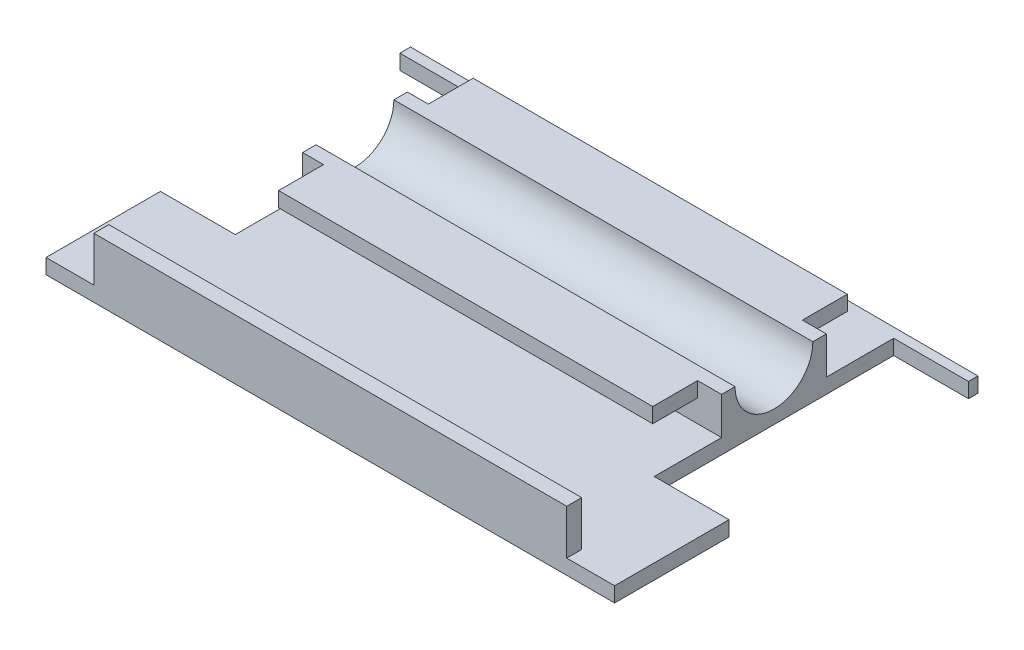
ISO-10303-21;
HEADER;
FILE_DESCRIPTION(('STEP AP214'),'2;1');
FILE_NAME('part.step','',(''),(''),'','','');
FILE_SCHEMA(('AUTOMOTIVE_DESIGN { 1 0 10303 214 1 1 1 1 }'));
ENDSEC;
DATA;
#1=APPLICATION_CONTEXT('core data for automotive mechanical design processes');
#2=APPLICATION_PROTOCOL_DEFINITION('international standard','automotive_design',2000,#1);
#3=PRODUCT_CONTEXT('',#1,'mechanical');
#4=PRODUCT('Part','Part','',(#3));
#5=PRODUCT_RELATED_PRODUCT_CATEGORY('part','',(#4));
#6=PRODUCT_DEFINITION_FORMATION('','',#4);
#7=PRODUCT_DEFINITION_CONTEXT('part definition',#1,'design');
#8=PRODUCT_DEFINITION('design','',#6,#7);
#9=PRODUCT_DEFINITION_SHAPE('','',#8);
#10=(LENGTH_UNIT() NAMED_UNIT(*) SI_UNIT(.MILLI.,.METRE.));
#11=(NAMED_UNIT(*) PLANE_ANGLE_UNIT() SI_UNIT($,.RADIAN.));
#12=(NAMED_UNIT(*) SI_UNIT($,.STERADIAN.) SOLID_ANGLE_UNIT());
#13=UNCERTAINTY_MEASURE_WITH_UNIT(LENGTH_MEASURE(1.E-05),#10,'distance_accuracy_value','');
#14=(GEOMETRIC_REPRESENTATION_CONTEXT(3) GLOBAL_UNCERTAINTY_ASSIGNED_CONTEXT((#13)) GLOBAL_UNIT_ASSIGNED_CONTEXT((#10,
#11,#12)) REPRESENTATION_CONTEXT('',''));
#15=CARTESIAN_POINT('',(0.,0.,0.));
#16=DIRECTION('',(0.,0.,1.));
#17=DIRECTION('',(1.,0.,0.));
#18=AXIS2_PLACEMENT_3D('',#15,#16,#17);
#19=CARTESIAN_POINT('',(-79.,20.,-66.7625819213889));
#20=DIRECTION('',(0.,0.,1.));
#21=DIRECTION('',(1.,0.,0.));
#22=AXIS2_PLACEMENT_3D('',#19,#20,#21);
#23=PLANE('',#22);
#24=DIRECTION('',(1.,0.,0.));
#25=VECTOR('',#24,1.);
#26=CARTESIAN_POINT('',(0.,20.,-66.7625819213889));
#27=LINE('',#26,#25);
#28=CARTESIAN_POINT('',(-79.,20.,-66.7625819213889));
#29=VERTEX_POINT('',#28);
#30=CARTESIAN_POINT('',(79.,20.,-66.7625819213889));
#31=VERTEX_POINT('',#30);
#32=EDGE_CURVE('E259',#29,#31,#27,.T.);
#33=ORIENTED_EDGE('',*,*,#32,.F.);
#34=DIRECTION('',(0.,-1.,0.));
#35=VECTOR('',#34,1.);
#36=CARTESIAN_POINT('',(-79.,20.,-66.7625819213889));
#37=LINE('',#36,#35);
#38=CARTESIAN_POINT('',(-79.,5.,-66.7625819213889));
#39=VERTEX_POINT('',#38);
#40=EDGE_CURVE('E274',#29,#39,#37,.T.);
#41=ORIENTED_EDGE('',*,*,#40,.T.);
#42=DIRECTION('',(1.,0.,0.));
#43=VECTOR('',#42,1.);
#44=CARTESIAN_POINT('',(0.,5.,-66.7625819213889));
#45=LINE('',#44,#43);
#46=CARTESIAN_POINT('',(-95.,5.,-66.7625819213889));
#47=VERTEX_POINT('',#46);
#48=EDGE_CURVE('E278',#47,#39,#45,.T.);
#49=ORIENTED_EDGE('',*,*,#48,.F.);
#50=DIRECTION('',(0.,1.,0.));
#51=VECTOR('',#50,1.);
#52=CARTESIAN_POINT('',(-95.,0.,-66.7625819213889));
#53=LINE('',#52,#51);
#54=CARTESIAN_POINT('',(-95.,0.,-66.7625819213889));
#55=VERTEX_POINT('',#54);
#56=EDGE_CURVE('E427',#55,#47,#53,.T.);
#57=ORIENTED_EDGE('',*,*,#56,.F.);
#58=DIRECTION('',(1.,0.,0.));
#59=VECTOR('',#58,1.);
#60=CARTESIAN_POINT('',(0.,0.,-66.7625819213889));
#61=LINE('',#60,#59);
#62=CARTESIAN_POINT('',(95.,0.,-66.7625819213889));
#63=VERTEX_POINT('',#62);
#64=EDGE_CURVE('E284',#55,#63,#61,.T.);
#65=ORIENTED_EDGE('',*,*,#64,.T.);
#66=DIRECTION('',(0.,-1.,0.));
#67=VECTOR('',#66,1.);
#68=CARTESIAN_POINT('',(95.,0.,-66.7625819213889));
#69=LINE('',#68,#67);
#70=CARTESIAN_POINT('',(95.,5.,-66.7625819213889));
#71=VERTEX_POINT('',#70);
#72=EDGE_CURVE('E294',#71,#63,#69,.T.);
#73=ORIENTED_EDGE('',*,*,#72,.F.);
#74=CARTESIAN_POINT('',(79.,5.,-66.7625819213889));
#75=VERTEX_POINT('',#74);
#76=EDGE_CURVE('E430',#75,#71,#45,.T.);
#77=ORIENTED_EDGE('',*,*,#76,.F.);
#78=DIRECTION('',(0.,1.,0.));
#79=VECTOR('',#78,1.);
#80=CARTESIAN_POINT('',(79.,20.,-66.7625819213889));
#81=LINE('',#80,#79);
#82=EDGE_CURVE('E276',#75,#31,#81,.T.);
#83=ORIENTED_EDGE('',*,*,#82,.T.);
#84=EDGE_LOOP('',(#33,#41,#49,#57,#65,#73,#77,#83));
#85=FACE_BOUND('',#84,.T.);
#86=ADVANCED_FACE('F47',(#85),#23,.T.);
#87=CARTESIAN_POINT('',(0.,0.,-112.5));
#88=DIRECTION('',(0.,0.,1.));
#89=DIRECTION('',(1.,0.,0.));
#90=AXIS2_PLACEMENT_3D('',#87,#88,#89);
#91=PLANE('',#90);
#92=DIRECTION('',(0.,-1.,0.));
#93=VECTOR('',#92,1.);
#94=CARTESIAN_POINT('',(-63.,17.5,-112.5));
#95=LINE('',#94,#93);
#96=CARTESIAN_POINT('',(-63.,17.5,-112.5));
#97=VERTEX_POINT('',#96);
#98=CARTESIAN_POINT('',(-63.,12.5,-112.5));
#99=VERTEX_POINT('',#98);
#100=EDGE_CURVE('E489',#97,#99,#95,.T.);
#101=ORIENTED_EDGE('',*,*,#100,.T.);
#102=DIRECTION('',(1.,0.,0.));
#103=VECTOR('',#102,1.);
#104=CARTESIAN_POINT('',(-63.,12.5,-112.5));
#105=LINE('',#104,#103);
#106=CARTESIAN_POINT('',(62.,12.5,-112.5));
#107=VERTEX_POINT('',#106);
#108=EDGE_CURVE('E493',#99,#107,#105,.T.);
#109=ORIENTED_EDGE('',*,*,#108,.T.);
#110=DIRECTION('',(0.,1.,0.));
#111=VECTOR('',#110,1.);
#112=CARTESIAN_POINT('',(62.,17.5,-112.5));
#113=LINE('',#112,#111);
#114=CARTESIAN_POINT('',(62.,17.5,-112.5));
#115=VERTEX_POINT('',#114);
#116=EDGE_CURVE('E497',#107,#115,#113,.T.);
#117=ORIENTED_EDGE('',*,*,#116,.T.);
#118=DIRECTION('',(-1.,0.,0.));
#119=VECTOR('',#118,1.);
#120=CARTESIAN_POINT('',(-63.,17.5,-112.5));
#121=LINE('',#120,#119);
#122=EDGE_CURVE('E500',#115,#97,#121,.T.);
#123=ORIENTED_EDGE('',*,*,#122,.T.);
#124=EDGE_LOOP('',(#101,#109,#117,#123));
#125=FACE_BOUND('',#124,.T.);
#126=ADVANCED_FACE('F659',(#125),#91,.T.);
#127=CARTESIAN_POINT('',(62.,12.5,-177.5));
#128=DIRECTION('',(0.,1.,0.));
#129=DIRECTION('',(0.,0.,1.));
#130=AXIS2_PLACEMENT_3D('',#127,#128,#129);
#131=PLANE('',#130);
#132=DIRECTION('',(-1.,0.,0.));
#133=VECTOR('',#132,1.);
#134=CARTESIAN_POINT('',(62.,12.5,-162.5));
#135=LINE('',#134,#133);
#136=CARTESIAN_POINT('',(62.,12.5,-162.5));
#137=VERTEX_POINT('',#136);
#138=CARTESIAN_POINT('',(-63.,12.5,-162.5));
#139=VERTEX_POINT('',#138);
#140=EDGE_CURVE('E471',#137,#139,#135,.T.);
#141=ORIENTED_EDGE('',*,*,#140,.T.);
#142=DIRECTION('',(0.,0.,1.));
#143=VECTOR('',#142,1.);
#144=CARTESIAN_POINT('',(-63.,12.5,-177.5));
#145=LINE('',#144,#143);
#146=CARTESIAN_POINT('',(-63.,12.5,-177.5));
#147=VERTEX_POINT('',#146);
#148=EDGE_CURVE('E73',#147,#139,#145,.T.);
#149=ORIENTED_EDGE('',*,*,#148,.F.);
#150=DIRECTION('',(-1.,0.,0.));
#151=VECTOR('',#150,1.);
#152=CARTESIAN_POINT('',(62.,12.5,-177.5));
#153=LINE('',#152,#151);
#154=CARTESIAN_POINT('',(62.,12.5,-177.5));
#155=VERTEX_POINT('',#154);
#156=EDGE_CURVE('E462',#155,#147,#153,.T.);
#157=ORIENTED_EDGE('',*,*,#156,.F.);
#158=DIRECTION('',(0.,0.,1.));
#159=VECTOR('',#158,1.);
#160=CARTESIAN_POINT('',(62.,12.5,-177.5));
#161=LINE('',#160,#159);
#162=EDGE_CURVE('E481',#155,#137,#161,.T.);
#163=ORIENTED_EDGE('',*,*,#162,.T.);
#164=EDGE_LOOP('',(#141,#149,#157,#163));
#165=FACE_BOUND('',#164,.T.);
#166=ADVANCED_FACE('F676',(#165),#131,.F.);
#167=CARTESIAN_POINT('',(-63.,12.5,-177.5));
#168=DIRECTION('',(1.,0.,0.));
#169=DIRECTION('',(0.,0.,-1.));
#170=AXIS2_PLACEMENT_3D('',#167,#168,#169);
#171=PLANE('',#170);
#172=DIRECTION('',(0.,1.,0.));
#173=VECTOR('',#172,1.);
#174=CARTESIAN_POINT('',(-63.,12.5,-162.5));
#175=LINE('',#174,#173);
#176=CARTESIAN_POINT('',(-63.,17.5,-162.5));
#177=VERTEX_POINT('',#176);
#178=EDGE_CURVE('E459',#139,#177,#175,.T.);
#179=ORIENTED_EDGE('',*,*,#178,.T.);
#180=DIRECTION('',(0.,0.,1.));
#181=VECTOR('',#180,1.);
#182=CARTESIAN_POINT('',(-63.,17.5,-177.5));
#183=LINE('',#182,#181);
#184=CARTESIAN_POINT('',(-63.,17.5,-177.5));
#185=VERTEX_POINT('',#184);
#186=EDGE_CURVE('E468',#185,#177,#183,.T.);
#187=ORIENTED_EDGE('',*,*,#186,.F.);
#188=DIRECTION('',(0.,1.,0.));
#189=VECTOR('',#188,1.);
#190=CARTESIAN_POINT('',(-63.,12.5,-177.5));
#191=LINE('',#190,#189);
#192=EDGE_CURVE('E465',#147,#185,#191,.T.);
#193=ORIENTED_EDGE('',*,*,#192,.F.);
#194=ORIENTED_EDGE('',*,*,#148,.T.);
#195=EDGE_LOOP('',(#179,#187,#193,#194));
#196=FACE_BOUND('',#195,.T.);
#197=ADVANCED_FACE('F682',(#196),#171,.F.);
#198=CARTESIAN_POINT('',(0.,0.,-177.5));
#199=DIRECTION('',(0.,0.,-1.));
#200=DIRECTION('',(-1.,0.,0.));
#201=AXIS2_PLACEMENT_3D('',#198,#199,#200);
#202=PLANE('',#201);
#203=DIRECTION('',(1.,0.,0.));
#204=VECTOR('',#203,1.);
#205=CARTESIAN_POINT('',(-63.,17.5,-177.5));
#206=LINE('',#205,#204);
#207=CARTESIAN_POINT('',(62.,17.5,-177.5));
#208=VERTEX_POINT('',#207);
#209=EDGE_CURVE('E454',#185,#208,#206,.T.);
#210=ORIENTED_EDGE('',*,*,#209,.T.);
#211=DIRECTION('',(0.,-1.,0.));
#212=VECTOR('',#211,1.);
#213=CARTESIAN_POINT('',(62.,17.5,-177.5));
#214=LINE('',#213,#212);
#215=EDGE_CURVE('E458',#208,#155,#214,.T.);
#216=ORIENTED_EDGE('',*,*,#215,.T.);
#217=ORIENTED_EDGE('',*,*,#156,.T.);
#218=ORIENTED_EDGE('',*,*,#192,.T.);
#219=EDGE_LOOP('',(#210,#216,#217,#218));
#220=FACE_BOUND('',#219,.T.);
#221=ADVANCED_FACE('F692',(#220),#202,.T.);
#222=CARTESIAN_POINT('',(62.,17.5,-177.5));
#223=DIRECTION('',(-1.,0.,0.));
#224=DIRECTION('',(0.,0.,1.));
#225=AXIS2_PLACEMENT_3D('',#222,#223,#224);
#226=PLANE('',#225);
#227=DIRECTION('',(0.,-1.,0.));
#228=VECTOR('',#227,1.);
#229=CARTESIAN_POINT('',(62.,17.5,-162.5));
#230=LINE('',#229,#228);
#231=CARTESIAN_POINT('',(62.,17.5,-162.5));
#232=VERTEX_POINT('',#231);
#233=EDGE_CURVE('E441',#232,#137,#230,.T.);
#234=ORIENTED_EDGE('',*,*,#233,.T.);
#235=ORIENTED_EDGE('',*,*,#162,.F.);
#236=ORIENTED_EDGE('',*,*,#215,.F.);
#237=DIRECTION('',(0.,0.,1.));
#238=VECTOR('',#237,1.);
#239=CARTESIAN_POINT('',(62.,17.5,-177.5));
#240=LINE('',#239,#238);
#241=EDGE_CURVE('E485',#208,#232,#240,.T.);
#242=ORIENTED_EDGE('',*,*,#241,.T.);
#243=EDGE_LOOP('',(#234,#235,#236,#242));
#244=FACE_BOUND('',#243,.T.);
#245=ADVANCED_FACE('F687',(#244),#226,.F.);
#246=CARTESIAN_POINT('',(62.,17.5,-112.5));
#247=DIRECTION('',(-1.,0.,0.));
#248=DIRECTION('',(0.,0.,1.));
#249=AXIS2_PLACEMENT_3D('',#246,#247,#248);
#250=PLANE('',#249);
#251=DIRECTION('',(0.,1.,0.));
#252=VECTOR('',#251,1.);
#253=CARTESIAN_POINT('',(62.,17.5,-127.5));
#254=LINE('',#253,#252);
#255=CARTESIAN_POINT('',(62.,12.5,-127.5));
#256=VERTEX_POINT('',#255);
#257=CARTESIAN_POINT('',(62.,17.5,-127.5));
#258=VERTEX_POINT('',#257);
#259=EDGE_CURVE('E494',#256,#258,#254,.T.);
#260=ORIENTED_EDGE('',*,*,#259,.T.);
#261=DIRECTION('',(0.,0.,-1.));
#262=VECTOR('',#261,1.);
#263=CARTESIAN_POINT('',(62.,17.5,-112.5));
#264=LINE('',#263,#262);
#265=EDGE_CURVE('E515',#115,#258,#264,.T.);
#266=ORIENTED_EDGE('',*,*,#265,.F.);
#267=ORIENTED_EDGE('',*,*,#116,.F.);
#268=DIRECTION('',(0.,0.,-1.));
#269=VECTOR('',#268,1.);
#270=CARTESIAN_POINT('',(62.,12.5,-112.5));
#271=LINE('',#270,#269);
#272=EDGE_CURVE('E518',#107,#256,#271,.T.);
#273=ORIENTED_EDGE('',*,*,#272,.T.);
#274=EDGE_LOOP('',(#260,#266,#267,#273));
#275=FACE_BOUND('',#274,.T.);
#276=ADVANCED_FACE('F663',(#275),#250,.F.);
#277=CARTESIAN_POINT('',(-63.,17.5,-112.5));
#278=DIRECTION('',(1.,0.,0.));
#279=DIRECTION('',(0.,0.,-1.));
#280=AXIS2_PLACEMENT_3D('',#277,#278,#279);
#281=PLANE('',#280);
#282=DIRECTION('',(0.,-1.,0.));
#283=VECTOR('',#282,1.);
#284=CARTESIAN_POINT('',(-63.,17.5,-127.5));
#285=LINE('',#284,#283);
#286=CARTESIAN_POINT('',(-63.,17.5,-127.5));
#287=VERTEX_POINT('',#286);
#288=CARTESIAN_POINT('',(-63.,12.5,-127.5));
#289=VERTEX_POINT('',#288);
#290=EDGE_CURVE('E488',#287,#289,#285,.T.);
#291=ORIENTED_EDGE('',*,*,#290,.T.);
#292=DIRECTION('',(0.,0.,-1.));
#293=VECTOR('',#292,1.);
#294=CARTESIAN_POINT('',(-63.,12.5,-112.5));
#295=LINE('',#294,#293);
#296=EDGE_CURVE('E522',#99,#289,#295,.T.);
#297=ORIENTED_EDGE('',*,*,#296,.F.);
#298=ORIENTED_EDGE('',*,*,#100,.F.);
#299=DIRECTION('',(0.,0.,-1.));
#300=VECTOR('',#299,1.);
#301=CARTESIAN_POINT('',(-63.,17.5,-112.5));
#302=LINE('',#301,#300);
#303=EDGE_CURVE('E503',#97,#287,#302,.T.);
#304=ORIENTED_EDGE('',*,*,#303,.T.);
#305=EDGE_LOOP('',(#291,#297,#298,#304));
#306=FACE_BOUND('',#305,.T.);
#307=ADVANCED_FACE('F657',(#306),#281,.F.);
#308=CARTESIAN_POINT('',(-63.,12.5,-112.5));
#309=DIRECTION('',(0.,1.,0.));
#310=DIRECTION('',(0.,0.,1.));
#311=AXIS2_PLACEMENT_3D('',#308,#309,#310);
#312=PLANE('',#311);
#313=DIRECTION('',(1.,0.,0.));
#314=VECTOR('',#313,1.);
#315=CARTESIAN_POINT('',(-63.,12.5,-127.5));
#316=LINE('',#315,#314);
#317=EDGE_CURVE('E507',#289,#256,#316,.T.);
#318=ORIENTED_EDGE('',*,*,#317,.T.);
#319=ORIENTED_EDGE('',*,*,#272,.F.);
#320=ORIENTED_EDGE('',*,*,#108,.F.);
#321=ORIENTED_EDGE('',*,*,#296,.T.);
#322=EDGE_LOOP('',(#318,#319,#320,#321));
#323=FACE_BOUND('',#322,.T.);
#324=ADVANCED_FACE('F665',(#323),#312,.F.);
#325=CARTESIAN_POINT('',(-70.,17.5,-127.5));
#326=DIRECTION('',(0.,1.,0.));
#327=DIRECTION('',(0.,0.,1.));
#328=AXIS2_PLACEMENT_3D('',#325,#326,#327);
#329=PLANE('',#328);
#330=DIRECTION('',(0.,0.,1.));
#331=VECTOR('',#330,1.);
#332=CARTESIAN_POINT('',(70.,17.5,-127.5));
#333=LINE('',#332,#331);
#334=CARTESIAN_POINT('',(70.,17.5,-132.));
#335=VERTEX_POINT('',#334);
#336=CARTESIAN_POINT('',(70.,17.5,-127.5));
#337=VERTEX_POINT('',#336);
#338=EDGE_CURVE('E392',#335,#337,#333,.T.);
#339=ORIENTED_EDGE('',*,*,#338,.F.);
#340=DIRECTION('',(1.,0.,0.));
#341=VECTOR('',#340,1.);
#342=CARTESIAN_POINT('',(-70.,17.5,-132.));
#343=LINE('',#342,#341);
#344=CARTESIAN_POINT('',(-70.,17.5,-132.));
#345=VERTEX_POINT('',#344);
#346=EDGE_CURVE('E405',#345,#335,#343,.T.);
#347=ORIENTED_EDGE('',*,*,#346,.F.);
#348=DIRECTION('',(0.,0.,1.));
#349=VECTOR('',#348,1.);
#350=CARTESIAN_POINT('',(-70.,17.5,-127.5));
#351=LINE('',#350,#349);
#352=CARTESIAN_POINT('',(-70.,17.5,-127.5));
#353=VERTEX_POINT('',#352);
#354=EDGE_CURVE('E370',#345,#353,#351,.T.);
#355=ORIENTED_EDGE('',*,*,#354,.T.);
#356=DIRECTION('',(1.,0.,0.));
#357=VECTOR('',#356,1.);
#358=CARTESIAN_POINT('',(-70.,17.5,-127.5));
#359=LINE('',#358,#357);
#360=EDGE_CURVE('E399',#353,#287,#359,.T.);
#361=ORIENTED_EDGE('',*,*,#360,.T.);
#362=ORIENTED_EDGE('',*,*,#303,.F.);
#363=ORIENTED_EDGE('',*,*,#122,.F.);
#364=ORIENTED_EDGE('',*,*,#265,.T.);
#365=EDGE_CURVE('E404',#258,#337,#359,.T.);
#366=ORIENTED_EDGE('',*,*,#365,.T.);
#367=EDGE_LOOP('',(#339,#347,#355,#361,#362,#363,#364,#366));
#368=FACE_BOUND('',#367,.T.);
#369=ADVANCED_FACE('F637',(#368),#329,.T.);
#370=CARTESIAN_POINT('',(0.,5.,0.));
#371=DIRECTION('',(0.,1.,0.));
#372=DIRECTION('',(0.,0.,1.));
#373=AXIS2_PLACEMENT_3D('',#370,#371,#372);
#374=PLANE('',#373);
#375=DIRECTION('',(0.999997914688224,0.,0.00204220939251803));
#376=VECTOR('',#375,1.);
#377=CARTESIAN_POINT('',(-95.,5.,-188.571267430675));
#378=LINE('',#377,#376);
#379=CARTESIAN_POINT('',(-95.,5.,-188.571267430675));
#380=VERTEX_POINT('',#379);
#381=CARTESIAN_POINT('',(94.9999999999999,5.,-188.183246836953));
#382=VERTEX_POINT('',#381);
#383=EDGE_CURVE('E525',#380,#382,#378,.T.);
#384=ORIENTED_EDGE('',*,*,#383,.F.);
#385=DIRECTION('',(0.,0.,-1.));
#386=VECTOR('',#385,1.);
#387=CARTESIAN_POINT('',(-95.,5.,-245.));
#388=LINE('',#387,#386);
#389=CARTESIAN_POINT('',(-95.,5.,-185.));
#390=VERTEX_POINT('',#389);
#391=EDGE_CURVE('E546',#390,#380,#388,.T.);
#392=ORIENTED_EDGE('',*,*,#391,.F.);
#393=DIRECTION('',(1.,0.,0.));
#394=VECTOR('',#393,1.);
#395=CARTESIAN_POINT('',(-95.,5.,-185.));
#396=LINE('',#395,#394);
#397=CARTESIAN_POINT('',(-70.,5.,-185.));
#398=VERTEX_POINT('',#397);
#399=EDGE_CURVE('E550',#390,#398,#396,.T.);
#400=ORIENTED_EDGE('',*,*,#399,.T.);
#401=DIRECTION('',(0.,0.,1.));
#402=VECTOR('',#401,1.);
#403=CARTESIAN_POINT('',(-70.,5.,245.));
#404=LINE('',#403,#402);
#405=CARTESIAN_POINT('',(-70.,5.,-162.294034417738));
#406=VERTEX_POINT('',#405);
#407=EDGE_CURVE('E591',#398,#406,#404,.T.);
#408=ORIENTED_EDGE('',*,*,#407,.T.);
#409=DIRECTION('',(-1.,0.,0.));
#410=VECTOR('',#409,1.);
#411=CARTESIAN_POINT('',(0.,5.,-162.294034417738));
#412=LINE('',#411,#410);
#413=CARTESIAN_POINT('',(70.,4.99999999999999,-162.294034417738));
#414=VERTEX_POINT('',#413);
#415=EDGE_CURVE('E11',#414,#406,#412,.T.);
#416=ORIENTED_EDGE('',*,*,#415,.F.);
#417=DIRECTION('',(0.,0.,-1.));
#418=VECTOR('',#417,1.);
#419=CARTESIAN_POINT('',(70.,5.,245.));
#420=LINE('',#419,#418);
#421=CARTESIAN_POINT('',(70.,5.,-185.));
#422=VERTEX_POINT('',#421);
#423=EDGE_CURVE('E595',#414,#422,#420,.T.);
#424=ORIENTED_EDGE('',*,*,#423,.T.);
#425=DIRECTION('',(-1.,0.,0.));
#426=VECTOR('',#425,1.);
#427=CARTESIAN_POINT('',(95.,4.99999999999999,-185.));
#428=LINE('',#427,#426);
#429=CARTESIAN_POINT('',(95.,4.99999999999999,-185.));
#430=VERTEX_POINT('',#429);
#431=EDGE_CURVE('E333',#430,#422,#428,.T.);
#432=ORIENTED_EDGE('',*,*,#431,.F.);
#433=DIRECTION('',(0.,0.,1.));
#434=VECTOR('',#433,1.);
#435=CARTESIAN_POINT('',(95.,5.,-245.));
#436=LINE('',#435,#434);
#437=EDGE_CURVE('E346',#382,#430,#436,.T.);
#438=ORIENTED_EDGE('',*,*,#437,.F.);
#439=EDGE_LOOP('',(#384,#392,#400,#408,#416,#424,#432,#438));
#440=FACE_BOUND('',#439,.T.);
#441=ADVANCED_FACE('F608',(#440),#374,.T.);
#442=CARTESIAN_POINT('',(-70.,3.5689017559513,-159.549400496549));
#443=DIRECTION('',(0.,-0.886702028941894,-0.46234133696905));
#444=DIRECTION('',(0.,0.46234133696905,-0.886702028941894));
#445=AXIS2_PLACEMENT_3D('',#442,#443,#444);
#446=PLANE('',#445);
#447=DIRECTION('',(0.,0.46234133696905,-0.886702028941894));
#448=VECTOR('',#447,1.);
#449=CARTESIAN_POINT('',(70.,3.5689017559513,-159.549400496549));
#450=LINE('',#449,#448);
#451=CARTESIAN_POINT('',(70.,5.10739391539057,-162.5));
#452=VERTEX_POINT('',#451);
#453=EDGE_CURVE('E331',#414,#452,#450,.T.);
#454=ORIENTED_EDGE('',*,*,#453,.F.);
#455=ORIENTED_EDGE('',*,*,#415,.T.);
#456=DIRECTION('',(0.,0.46234133696905,-0.886702028941894));
#457=VECTOR('',#456,1.);
#458=CARTESIAN_POINT('',(-70.,3.5689017559513,-159.549400496549));
#459=LINE('',#458,#457);
#460=CARTESIAN_POINT('',(-70.,5.10739391539057,-162.5));
#461=VERTEX_POINT('',#460);
#462=EDGE_CURVE('E355',#406,#461,#459,.T.);
#463=ORIENTED_EDGE('',*,*,#462,.T.);
#464=DIRECTION('',(1.,0.,0.));
#465=VECTOR('',#464,1.);
#466=CARTESIAN_POINT('',(-70.,5.10739391539057,-162.5));
#467=LINE('',#466,#465);
#468=EDGE_CURVE('E378',#461,#452,#467,.T.);
#469=ORIENTED_EDGE('',*,*,#468,.T.);
#470=EDGE_LOOP('',(#454,#455,#463,#469));
#471=FACE_BOUND('',#470,.T.);
#472=ADVANCED_FACE('F718',(#471),#446,.T.);
#473=CARTESIAN_POINT('',(-70.,17.5,-162.5));
#474=DIRECTION('',(0.,0.,-1.));
#475=DIRECTION('',(-1.,0.,0.));
#476=AXIS2_PLACEMENT_3D('',#473,#474,#475);
#477=PLANE('',#476);
#478=ORIENTED_EDGE('',*,*,#140,.F.);
#479=ORIENTED_EDGE('',*,*,#233,.F.);
#480=DIRECTION('',(1.,0.,0.));
#481=VECTOR('',#480,1.);
#482=CARTESIAN_POINT('',(-70.,17.5,-162.5));
#483=LINE('',#482,#481);
#484=CARTESIAN_POINT('',(70.,17.5,-162.5));
#485=VERTEX_POINT('',#484);
#486=EDGE_CURVE('E417',#232,#485,#483,.T.);
#487=ORIENTED_EDGE('',*,*,#486,.T.);
#488=DIRECTION('',(0.,1.,0.));
#489=VECTOR('',#488,1.);
#490=CARTESIAN_POINT('',(70.,17.5,-162.5));
#491=LINE('',#490,#489);
#492=EDGE_CURVE('E381',#452,#485,#491,.T.);
#493=ORIENTED_EDGE('',*,*,#492,.F.);
#494=ORIENTED_EDGE('',*,*,#468,.F.);
#495=DIRECTION('',(0.,1.,0.));
#496=VECTOR('',#495,1.);
#497=CARTESIAN_POINT('',(-70.,17.5,-162.5));
#498=LINE('',#497,#496);
#499=CARTESIAN_POINT('',(-70.,17.5,-162.5));
#500=VERTEX_POINT('',#499);
#501=EDGE_CURVE('E358',#461,#500,#498,.T.);
#502=ORIENTED_EDGE('',*,*,#501,.T.);
#503=EDGE_CURVE('E413',#500,#177,#483,.T.);
#504=ORIENTED_EDGE('',*,*,#503,.T.);
#505=ORIENTED_EDGE('',*,*,#178,.F.);
#506=EDGE_LOOP('',(#478,#479,#487,#493,#494,#502,#504,#505));
#507=FACE_BOUND('',#506,.T.);
#508=ADVANCED_FACE('F707',(#507),#477,.T.);
#509=CARTESIAN_POINT('',(-70.,17.5,-158.));
#510=DIRECTION('',(0.,1.,0.));
#511=DIRECTION('',(0.,0.,1.));
#512=AXIS2_PLACEMENT_3D('',#509,#510,#511);
#513=PLANE('',#512);
#514=DIRECTION('',(0.,0.,1.));
#515=VECTOR('',#514,1.);
#516=CARTESIAN_POINT('',(70.,17.5,-158.));
#517=LINE('',#516,#515);
#518=CARTESIAN_POINT('',(70.,17.5,-158.));
#519=VERTEX_POINT('',#518);
#520=EDGE_CURVE('E385',#485,#519,#517,.T.);
#521=ORIENTED_EDGE('',*,*,#520,.F.);
#522=ORIENTED_EDGE('',*,*,#486,.F.);
#523=ORIENTED_EDGE('',*,*,#241,.F.);
#524=ORIENTED_EDGE('',*,*,#209,.F.);
#525=ORIENTED_EDGE('',*,*,#186,.T.);
#526=ORIENTED_EDGE('',*,*,#503,.F.);
#527=DIRECTION('',(0.,0.,1.));
#528=VECTOR('',#527,1.);
#529=CARTESIAN_POINT('',(-70.,17.5,-158.));
#530=LINE('',#529,#528);
#531=CARTESIAN_POINT('',(-70.,17.5,-158.));
#532=VERTEX_POINT('',#531);
#533=EDGE_CURVE('E363',#500,#532,#530,.T.);
#534=ORIENTED_EDGE('',*,*,#533,.T.);
#535=DIRECTION('',(1.,0.,0.));
#536=VECTOR('',#535,1.);
#537=CARTESIAN_POINT('',(-70.,17.5,-158.));
#538=LINE('',#537,#536);
#539=EDGE_CURVE('E409',#532,#519,#538,.T.);
#540=ORIENTED_EDGE('',*,*,#539,.T.);
#541=EDGE_LOOP('',(#521,#522,#523,#524,#525,#526,#534,#540));
#542=FACE_BOUND('',#541,.T.);
#543=ADVANCED_FACE('F711',(#542),#513,.T.);
#544=CARTESIAN_POINT('',(-70.,17.5,-145.));
#545=DIRECTION('',(1.,0.,0.));
#546=DIRECTION('',(0.,0.,-1.));
#547=AXIS2_PLACEMENT_3D('',#544,#545,#546);
#548=CYLINDRICAL_SURFACE('',#547,13.);
#549=CARTESIAN_POINT('',(70.,17.5,-145.));
#550=DIRECTION('',(-1.,0.,0.));
#551=DIRECTION('',(0.,0.,-1.));
#552=AXIS2_PLACEMENT_3D('',#549,#550,#551);
#553=CIRCLE('',#552,13.);
#554=EDGE_CURVE('E389',#519,#335,#553,.T.);
#555=ORIENTED_EDGE('',*,*,#554,.F.);
#556=ORIENTED_EDGE('',*,*,#539,.F.);
#557=CARTESIAN_POINT('',(-70.,17.5,-145.));
#558=DIRECTION('',(-1.,0.,0.));
#559=DIRECTION('',(0.,0.,-1.));
#560=AXIS2_PLACEMENT_3D('',#557,#558,#559);
#561=CIRCLE('',#560,13.);
#562=EDGE_CURVE('E367',#532,#345,#561,.T.);
#563=ORIENTED_EDGE('',*,*,#562,.T.);
#564=ORIENTED_EDGE('',*,*,#346,.T.);
#565=EDGE_LOOP('',(#555,#556,#563,#564));
#566=FACE_BOUND('',#565,.T.);
#567=ADVANCED_FACE('F649',(#566),#548,.F.);
#568=CARTESIAN_POINT('',(0.,20.,0.));
#569=DIRECTION('',(0.,1.,0.));
#570=DIRECTION('',(0.,0.,1.));
#571=AXIS2_PLACEMENT_3D('',#568,#569,#570);
#572=PLANE('',#571);
#573=DIRECTION('',(0.,0.,1.));
#574=VECTOR('',#573,1.);
#575=CARTESIAN_POINT('',(-79.,20.,-71.7625819213889));
#576=LINE('',#575,#574);
#577=CARTESIAN_POINT('',(-79.,20.,-71.7625819213889));
#578=VERTEX_POINT('',#577);
#579=EDGE_CURVE('E256',#578,#29,#576,.T.);
#580=ORIENTED_EDGE('',*,*,#579,.T.);
#581=ORIENTED_EDGE('',*,*,#32,.T.);
#582=DIRECTION('',(0.,0.,-1.));
#583=VECTOR('',#582,1.);
#584=CARTESIAN_POINT('',(79.,20.,-71.7625819213889));
#585=LINE('',#584,#583);
#586=CARTESIAN_POINT('',(79.,20.,-71.7625819213889));
#587=VERTEX_POINT('',#586);
#588=EDGE_CURVE('E268',#31,#587,#585,.T.);
#589=ORIENTED_EDGE('',*,*,#588,.T.);
#590=DIRECTION('',(-1.,0.,0.));
#591=VECTOR('',#590,1.);
#592=CARTESIAN_POINT('',(-79.,20.,-71.7625819213889));
#593=LINE('',#592,#591);
#594=EDGE_CURVE('E262',#587,#578,#593,.T.);
#595=ORIENTED_EDGE('',*,*,#594,.T.);
#596=EDGE_LOOP('',(#580,#581,#589,#595));
#597=FACE_BOUND('',#596,.T.);
#598=ADVANCED_FACE('F258',(#597),#572,.T.);
#599=CARTESIAN_POINT('',(-70.,6.05690961158449,-127.5));
#600=DIRECTION('',(0.,0.,1.));
#601=DIRECTION('',(1.,0.,0.));
#602=AXIS2_PLACEMENT_3D('',#599,#600,#601);
#603=PLANE('',#602);
#604=ORIENTED_EDGE('',*,*,#317,.F.);
#605=ORIENTED_EDGE('',*,*,#290,.F.);
#606=ORIENTED_EDGE('',*,*,#360,.F.);
#607=DIRECTION('',(0.,-1.,0.));
#608=VECTOR('',#607,1.);
#609=CARTESIAN_POINT('',(-70.,17.5,-127.5));
#610=LINE('',#609,#608);
#611=CARTESIAN_POINT('',(-70.,5.,-127.5));
#612=VERTEX_POINT('',#611);
#613=EDGE_CURVE('E374',#353,#612,#610,.T.);
#614=ORIENTED_EDGE('',*,*,#613,.T.);
#615=DIRECTION('',(1.,0.,0.));
#616=VECTOR('',#615,1.);
#617=CARTESIAN_POINT('',(0.,5.,-127.5));
#618=LINE('',#617,#616);
#619=CARTESIAN_POINT('',(70.,5.,-127.5));
#620=VERTEX_POINT('',#619);
#621=EDGE_CURVE('E57',#612,#620,#618,.T.);
#622=ORIENTED_EDGE('',*,*,#621,.T.);
#623=DIRECTION('',(0.,-1.,0.));
#624=VECTOR('',#623,1.);
#625=CARTESIAN_POINT('',(70.,6.05690961158449,-127.5));
#626=LINE('',#625,#624);
#627=EDGE_CURVE('E359',#337,#620,#626,.T.);
#628=ORIENTED_EDGE('',*,*,#627,.F.);
#629=ORIENTED_EDGE('',*,*,#365,.F.);
#630=ORIENTED_EDGE('',*,*,#259,.F.);
#631=EDGE_LOOP('',(#604,#605,#606,#614,#622,#628,#629,#630));
#632=FACE_BOUND('',#631,.T.);
#633=ADVANCED_FACE('F644',(#632),#603,.T.);
#634=CARTESIAN_POINT('',(79.,20.,-71.7625819213889));
#635=DIRECTION('',(-1.,0.,0.));
#636=DIRECTION('',(0.,0.,1.));
#637=AXIS2_PLACEMENT_3D('',#634,#635,#636);
#638=PLANE('',#637);
#639=ORIENTED_EDGE('',*,*,#82,.F.);
#640=DIRECTION('',(0.,0.,-1.));
#641=VECTOR('',#640,1.);
#642=CARTESIAN_POINT('',(79.,5.,-71.7625819213889));
#643=LINE('',#642,#641);
#644=CARTESIAN_POINT('',(79.,5.,-71.7625819213889));
#645=VERTEX_POINT('',#644);
#646=EDGE_CURVE('E65',#75,#645,#643,.T.);
#647=ORIENTED_EDGE('',*,*,#646,.T.);
#648=DIRECTION('',(0.,-1.,0.));
#649=VECTOR('',#648,1.);
#650=CARTESIAN_POINT('',(79.,20.,-71.7625819213889));
#651=LINE('',#650,#649);
#652=EDGE_CURVE('E438',#587,#645,#651,.T.);
#653=ORIENTED_EDGE('',*,*,#652,.F.);
#654=ORIENTED_EDGE('',*,*,#588,.F.);
#655=EDGE_LOOP('',(#639,#647,#653,#654));
#656=FACE_BOUND('',#655,.T.);
#657=ADVANCED_FACE('F437',(#656),#638,.F.);
#658=CARTESIAN_POINT('',(-79.,20.,-71.7625819213889));
#659=DIRECTION('',(0.,0.,1.));
#660=DIRECTION('',(1.,0.,0.));
#661=AXIS2_PLACEMENT_3D('',#658,#659,#660);
#662=PLANE('',#661);
#663=DIRECTION('',(-1.,0.,0.));
#664=VECTOR('',#663,1.);
#665=CARTESIAN_POINT('',(-79.,5.,-71.7625819213889));
#666=LINE('',#665,#664);
#667=CARTESIAN_POINT('',(-79.,5.,-71.7625819213889));
#668=VERTEX_POINT('',#667);
#669=EDGE_CURVE('E269',#645,#668,#666,.T.);
#670=ORIENTED_EDGE('',*,*,#669,.T.);
#671=DIRECTION('',(0.,-1.,0.));
#672=VECTOR('',#671,1.);
#673=CARTESIAN_POINT('',(-79.,20.,-71.7625819213889));
#674=LINE('',#673,#672);
#675=EDGE_CURVE('E442',#578,#668,#674,.T.);
#676=ORIENTED_EDGE('',*,*,#675,.F.);
#677=ORIENTED_EDGE('',*,*,#594,.F.);
#678=ORIENTED_EDGE('',*,*,#652,.T.);
#679=EDGE_LOOP('',(#670,#676,#677,#678));
#680=FACE_BOUND('',#679,.T.);
#681=ADVANCED_FACE('F444',(#680),#662,.F.);
#682=CARTESIAN_POINT('',(-79.,20.,-71.7625819213889));
#683=DIRECTION('',(1.,0.,0.));
#684=DIRECTION('',(0.,0.,-1.));
#685=AXIS2_PLACEMENT_3D('',#682,#683,#684);
#686=PLANE('',#685);
#687=ORIENTED_EDGE('',*,*,#40,.F.);
#688=ORIENTED_EDGE('',*,*,#579,.F.);
#689=ORIENTED_EDGE('',*,*,#675,.T.);
#690=DIRECTION('',(0.,0.,1.));
#691=VECTOR('',#690,1.);
#692=CARTESIAN_POINT('',(-79.,5.,-71.7625819213889));
#693=LINE('',#692,#691);
#694=EDGE_CURVE('E282',#668,#39,#693,.T.);
#695=ORIENTED_EDGE('',*,*,#694,.T.);
#696=EDGE_LOOP('',(#687,#688,#689,#695));
#697=FACE_BOUND('',#696,.T.);
#698=ADVANCED_FACE('F280',(#697),#686,.F.);
#699=CARTESIAN_POINT('',(70.,5.,245.));
#700=DIRECTION('',(-1.,0.,0.));
#701=DIRECTION('',(0.,0.,1.));
#702=AXIS2_PLACEMENT_3D('',#699,#700,#701);
#703=PLANE('',#702);
#704=ORIENTED_EDGE('',*,*,#520,.T.);
#705=ORIENTED_EDGE('',*,*,#554,.T.);
#706=ORIENTED_EDGE('',*,*,#338,.T.);
#707=ORIENTED_EDGE('',*,*,#627,.T.);
#708=CARTESIAN_POINT('',(70.,5.,-105.));
#709=VERTEX_POINT('',#708);
#710=EDGE_CURVE('E423',#709,#620,#420,.T.);
#711=ORIENTED_EDGE('',*,*,#710,.F.);
#712=DIRECTION('',(0.,1.,0.));
#713=VECTOR('',#712,1.);
#714=CARTESIAN_POINT('',(70.,5.,-105.));
#715=LINE('',#714,#713);
#716=CARTESIAN_POINT('',(70.,0.,-105.));
#717=VERTEX_POINT('',#716);
#718=EDGE_CURVE('E328',#717,#709,#715,.T.);
#719=ORIENTED_EDGE('',*,*,#718,.F.);
#720=DIRECTION('',(0.,0.,-1.));
#721=VECTOR('',#720,1.);
#722=CARTESIAN_POINT('',(70.,0.,245.));
#723=LINE('',#722,#721);
#724=CARTESIAN_POINT('',(70.,0.,-185.));
#725=VERTEX_POINT('',#724);
#726=EDGE_CURVE('E592',#717,#725,#723,.T.);
#727=ORIENTED_EDGE('',*,*,#726,.T.);
#728=DIRECTION('',(0.,-1.,0.));
#729=VECTOR('',#728,1.);
#730=CARTESIAN_POINT('',(70.,4.99999999999999,-185.));
#731=LINE('',#730,#729);
#732=EDGE_CURVE('E324',#422,#725,#731,.T.);
#733=ORIENTED_EDGE('',*,*,#732,.F.);
#734=ORIENTED_EDGE('',*,*,#423,.F.);
#735=ORIENTED_EDGE('',*,*,#453,.T.);
#736=ORIENTED_EDGE('',*,*,#492,.T.);
#737=EDGE_LOOP('',(#704,#705,#706,#707,#711,#719,#727,#733,#734,#735,#736));
#738=FACE_BOUND('',#737,.T.);
#739=ADVANCED_FACE('F645',(#738),#703,.F.);
#740=CARTESIAN_POINT('',(95.,4.99999999999999,-185.));
#741=DIRECTION('',(0.,0.,-1.));
#742=DIRECTION('',(0.,1.,0.));
#743=AXIS2_PLACEMENT_3D('',#740,#741,#742);
#744=PLANE('',#743);
#745=ORIENTED_EDGE('',*,*,#732,.T.);
#746=DIRECTION('',(-1.,0.,0.));
#747=VECTOR('',#746,1.);
#748=CARTESIAN_POINT('',(95.,0.,-185.));
#749=LINE('',#748,#747);
#750=CARTESIAN_POINT('',(95.,0.,-185.));
#751=VERTEX_POINT('',#750);
#752=EDGE_CURVE('E337',#751,#725,#749,.T.);
#753=ORIENTED_EDGE('',*,*,#752,.F.);
#754=DIRECTION('',(0.,-1.,0.));
#755=VECTOR('',#754,1.);
#756=CARTESIAN_POINT('',(95.,4.99999999999999,-185.));
#757=LINE('',#756,#755);
#758=EDGE_CURVE('E350',#430,#751,#757,.T.);
#759=ORIENTED_EDGE('',*,*,#758,.F.);
#760=ORIENTED_EDGE('',*,*,#431,.T.);
#761=EDGE_LOOP('',(#745,#753,#759,#760));
#762=FACE_BOUND('',#761,.T.);
#763=ADVANCED_FACE('F624',(#762),#744,.F.);
#764=CARTESIAN_POINT('',(95.,0.,0.));
#765=DIRECTION('',(-1.,0.,0.));
#766=DIRECTION('',(0.,0.,1.));
#767=AXIS2_PLACEMENT_3D('',#764,#765,#766);
#768=PLANE('',#767);
#769=DIRECTION('',(0.,0.,-1.));
#770=VECTOR('',#769,1.);
#771=CARTESIAN_POINT('',(95.,0.,-245.));
#772=LINE('',#771,#770);
#773=CARTESIAN_POINT('',(94.9999999999999,0.,-188.183246836953));
#774=VERTEX_POINT('',#773);
#775=EDGE_CURVE('E342',#751,#774,#772,.T.);
#776=ORIENTED_EDGE('',*,*,#775,.T.);
#777=DIRECTION('',(0.,1.,0.));
#778=VECTOR('',#777,1.);
#779=CARTESIAN_POINT('',(94.9999999999999,-0.00100000000000013,-188.183246836953));
#780=LINE('',#779,#778);
#781=EDGE_CURVE('E529',#774,#382,#780,.T.);
#782=ORIENTED_EDGE('',*,*,#781,.T.);
#783=ORIENTED_EDGE('',*,*,#437,.T.);
#784=ORIENTED_EDGE('',*,*,#758,.T.);
#785=EDGE_LOOP('',(#776,#782,#783,#784));
#786=FACE_BOUND('',#785,.T.);
#787=ADVANCED_FACE('F619',(#786),#768,.F.);
#788=CARTESIAN_POINT('',(-95.,-0.00100000000000013,-188.571267430675));
#789=DIRECTION('',(-0.00204220939251803,0.,0.999997914688224));
#790=DIRECTION('',(0.999997914688224,0.,0.00204220939251803));
#791=AXIS2_PLACEMENT_3D('',#788,#789,#790);
#792=PLANE('',#791);
#793=DIRECTION('',(-0.999997914688224,0.,-0.00204220939251803));
#794=VECTOR('',#793,1.);
#795=CARTESIAN_POINT('',(-95.,0.,-188.571267430675));
#796=LINE('',#795,#794);
#797=CARTESIAN_POINT('',(-95.,0.,-188.571267430675));
#798=VERTEX_POINT('',#797);
#799=EDGE_CURVE('E533',#774,#798,#796,.T.);
#800=ORIENTED_EDGE('',*,*,#799,.T.);
#801=DIRECTION('',(0.,1.,0.));
#802=VECTOR('',#801,1.);
#803=CARTESIAN_POINT('',(-95.,-0.00100000000000013,-188.571267430675));
#804=LINE('',#803,#802);
#805=EDGE_CURVE('E528',#798,#380,#804,.T.);
#806=ORIENTED_EDGE('',*,*,#805,.T.);
#807=ORIENTED_EDGE('',*,*,#383,.T.);
#808=ORIENTED_EDGE('',*,*,#781,.F.);
#809=EDGE_LOOP('',(#800,#806,#807,#808));
#810=FACE_BOUND('',#809,.T.);
#811=ADVANCED_FACE('F793',(#810),#792,.F.);
#812=CARTESIAN_POINT('',(-95.,0.,0.));
#813=DIRECTION('',(-1.,0.,0.));
#814=DIRECTION('',(0.,0.,1.));
#815=AXIS2_PLACEMENT_3D('',#812,#813,#814);
#816=PLANE('',#815);
#817=ORIENTED_EDGE('',*,*,#805,.F.);
#818=DIRECTION('',(0.,0.,1.));
#819=VECTOR('',#818,1.);
#820=CARTESIAN_POINT('',(-95.,0.,-245.));
#821=LINE('',#820,#819);
#822=CARTESIAN_POINT('',(-95.,0.,-185.));
#823=VERTEX_POINT('',#822);
#824=EDGE_CURVE('E539',#798,#823,#821,.T.);
#825=ORIENTED_EDGE('',*,*,#824,.T.);
#826=DIRECTION('',(0.,1.,0.));
#827=VECTOR('',#826,1.);
#828=CARTESIAN_POINT('',(-95.,5.,-185.));
#829=LINE('',#828,#827);
#830=EDGE_CURVE('E542',#823,#390,#829,.T.);
#831=ORIENTED_EDGE('',*,*,#830,.T.);
#832=ORIENTED_EDGE('',*,*,#391,.T.);
#833=EDGE_LOOP('',(#817,#825,#831,#832));
#834=FACE_BOUND('',#833,.T.);
#835=ADVANCED_FACE('F613',(#834),#816,.T.);
#836=CARTESIAN_POINT('',(-95.,5.,-185.));
#837=DIRECTION('',(0.,0.,-1.));
#838=DIRECTION('',(-1.,0.,0.));
#839=AXIS2_PLACEMENT_3D('',#836,#837,#838);
#840=PLANE('',#839);
#841=DIRECTION('',(0.,1.,0.));
#842=VECTOR('',#841,1.);
#843=CARTESIAN_POINT('',(-70.,5.,-185.));
#844=LINE('',#843,#842);
#845=CARTESIAN_POINT('',(-70.,0.,-185.));
#846=VERTEX_POINT('',#845);
#847=EDGE_CURVE('E543',#846,#398,#844,.T.);
#848=ORIENTED_EDGE('',*,*,#847,.T.);
#849=ORIENTED_EDGE('',*,*,#399,.F.);
#850=ORIENTED_EDGE('',*,*,#830,.F.);
#851=DIRECTION('',(1.,0.,0.));
#852=VECTOR('',#851,1.);
#853=CARTESIAN_POINT('',(-95.,0.,-185.));
#854=LINE('',#853,#852);
#855=EDGE_CURVE('E338',#823,#846,#854,.T.);
#856=ORIENTED_EDGE('',*,*,#855,.T.);
#857=EDGE_LOOP('',(#848,#849,#850,#856));
#858=FACE_BOUND('',#857,.T.);
#859=ADVANCED_FACE('F603',(#858),#840,.F.);
#860=CARTESIAN_POINT('',(-70.,5.,245.));
#861=DIRECTION('',(1.,0.,0.));
#862=DIRECTION('',(0.,0.,-1.));
#863=AXIS2_PLACEMENT_3D('',#860,#861,#862);
#864=PLANE('',#863);
#865=ORIENTED_EDGE('',*,*,#562,.F.);
#866=ORIENTED_EDGE('',*,*,#533,.F.);
#867=ORIENTED_EDGE('',*,*,#501,.F.);
#868=ORIENTED_EDGE('',*,*,#462,.F.);
#869=ORIENTED_EDGE('',*,*,#407,.F.);
#870=ORIENTED_EDGE('',*,*,#847,.F.);
#871=DIRECTION('',(0.,0.,1.));
#872=VECTOR('',#871,1.);
#873=CARTESIAN_POINT('',(-70.,0.,245.));
#874=LINE('',#873,#872);
#875=CARTESIAN_POINT('',(-70.,0.,-105.));
#876=VERTEX_POINT('',#875);
#877=EDGE_CURVE('E403',#846,#876,#874,.T.);
#878=ORIENTED_EDGE('',*,*,#877,.T.);
#879=DIRECTION('',(0.,-1.,0.));
#880=VECTOR('',#879,1.);
#881=CARTESIAN_POINT('',(-70.,5.,-105.));
#882=LINE('',#881,#880);
#883=CARTESIAN_POINT('',(-70.,5.,-105.));
#884=VERTEX_POINT('',#883);
#885=EDGE_CURVE('E554',#884,#876,#882,.T.);
#886=ORIENTED_EDGE('',*,*,#885,.F.);
#887=EDGE_CURVE('E587',#612,#884,#404,.T.);
#888=ORIENTED_EDGE('',*,*,#887,.F.);
#889=ORIENTED_EDGE('',*,*,#613,.F.);
#890=ORIENTED_EDGE('',*,*,#354,.F.);
#891=EDGE_LOOP('',(#865,#866,#867,#868,#869,#870,#878,#886,#888,#889,#890));
#892=FACE_BOUND('',#891,.T.);
#893=ADVANCED_FACE('F599',(#892),#864,.F.);
#894=CARTESIAN_POINT('',(-95.,5.,-105.));
#895=DIRECTION('',(0.,0.,1.));
#896=DIRECTION('',(1.,0.,0.));
#897=AXIS2_PLACEMENT_3D('',#894,#895,#896);
#898=PLANE('',#897);
#899=ORIENTED_EDGE('',*,*,#885,.T.);
#900=DIRECTION('',(1.,0.,0.));
#901=VECTOR('',#900,1.);
#902=CARTESIAN_POINT('',(-95.,0.,-105.));
#903=LINE('',#902,#901);
#904=CARTESIAN_POINT('',(-95.,0.,-105.));
#905=VERTEX_POINT('',#904);
#906=EDGE_CURVE('E538',#905,#876,#903,.T.);
#907=ORIENTED_EDGE('',*,*,#906,.F.);
#908=DIRECTION('',(0.,-1.,0.));
#909=VECTOR('',#908,1.);
#910=CARTESIAN_POINT('',(-95.,5.,-105.));
#911=LINE('',#910,#909);
#912=CARTESIAN_POINT('',(-95.,5.,-105.));
#913=VERTEX_POINT('',#912);
#914=EDGE_CURVE('E306',#913,#905,#911,.T.);
#915=ORIENTED_EDGE('',*,*,#914,.F.);
#916=DIRECTION('',(1.,0.,0.));
#917=VECTOR('',#916,1.);
#918=CARTESIAN_POINT('',(-95.,5.,-105.));
#919=LINE('',#918,#917);
#920=EDGE_CURVE('E303',#913,#884,#919,.T.);
#921=ORIENTED_EDGE('',*,*,#920,.T.);
#922=EDGE_LOOP('',(#899,#907,#915,#921));
#923=FACE_BOUND('',#922,.T.);
#924=ADVANCED_FACE('F577',(#923),#898,.F.);
#925=CARTESIAN_POINT('',(95.,5.,-105.));
#926=DIRECTION('',(0.,0.,1.));
#927=DIRECTION('',(0.,-1.,0.));
#928=AXIS2_PLACEMENT_3D('',#925,#926,#927);
#929=PLANE('',#928);
#930=ORIENTED_EDGE('',*,*,#718,.T.);
#931=DIRECTION('',(-1.,0.,0.));
#932=VECTOR('',#931,1.);
#933=CARTESIAN_POINT('',(95.,5.,-105.));
#934=LINE('',#933,#932);
#935=CARTESIAN_POINT('',(95.,5.,-105.));
#936=VERTEX_POINT('',#935);
#937=EDGE_CURVE('E311',#936,#709,#934,.T.);
#938=ORIENTED_EDGE('',*,*,#937,.F.);
#939=DIRECTION('',(0.,1.,0.));
#940=VECTOR('',#939,1.);
#941=CARTESIAN_POINT('',(95.,5.,-105.));
#942=LINE('',#941,#940);
#943=CARTESIAN_POINT('',(95.,0.,-105.));
#944=VERTEX_POINT('',#943);
#945=EDGE_CURVE('E310',#944,#936,#942,.T.);
#946=ORIENTED_EDGE('',*,*,#945,.F.);
#947=DIRECTION('',(-1.,0.,0.));
#948=VECTOR('',#947,1.);
#949=CARTESIAN_POINT('',(95.,0.,-105.));
#950=LINE('',#949,#948);
#951=EDGE_CURVE('E318',#944,#717,#950,.T.);
#952=ORIENTED_EDGE('',*,*,#951,.T.);
#953=EDGE_LOOP('',(#930,#938,#946,#952));
#954=FACE_BOUND('',#953,.T.);
#955=ADVANCED_FACE('F629',(#954),#929,.F.);
#956=CARTESIAN_POINT('',(0.,0.,0.));
#957=DIRECTION('',(0.,1.,0.));
#958=DIRECTION('',(0.,0.,1.));
#959=AXIS2_PLACEMENT_3D('',#956,#957,#958);
#960=PLANE('',#959);
#961=ORIENTED_EDGE('',*,*,#64,.F.);
#962=DIRECTION('',(0.,0.,1.));
#963=VECTOR('',#962,1.);
#964=CARTESIAN_POINT('',(-95.,0.,-105.));
#965=LINE('',#964,#963);
#966=EDGE_CURVE('E302',#905,#55,#965,.T.);
#967=ORIENTED_EDGE('',*,*,#966,.F.);
#968=ORIENTED_EDGE('',*,*,#906,.T.);
#969=ORIENTED_EDGE('',*,*,#877,.F.);
#970=ORIENTED_EDGE('',*,*,#855,.F.);
#971=ORIENTED_EDGE('',*,*,#824,.F.);
#972=ORIENTED_EDGE('',*,*,#799,.F.);
#973=ORIENTED_EDGE('',*,*,#775,.F.);
#974=ORIENTED_EDGE('',*,*,#752,.T.);
#975=ORIENTED_EDGE('',*,*,#726,.F.);
#976=ORIENTED_EDGE('',*,*,#951,.F.);
#977=DIRECTION('',(0.,0.,-1.));
#978=VECTOR('',#977,1.);
#979=CARTESIAN_POINT('',(95.,0.,99.9999999999999));
#980=LINE('',#979,#978);
#981=EDGE_CURVE('E51',#63,#944,#980,.T.);
#982=ORIENTED_EDGE('',*,*,#981,.F.);
#983=EDGE_LOOP('',(#961,#967,#968,#969,#970,#971,#972,#973,#974,#975,#976,#982));
#984=FACE_BOUND('',#983,.T.);
#985=ADVANCED_FACE('F581',(#984),#960,.F.);
#986=DIRECTION('',(0.,0.,-1.));
#987=VECTOR('',#986,1.);
#988=CARTESIAN_POINT('',(-95.,5.,-105.));
#989=LINE('',#988,#987);
#990=EDGE_CURVE('E299',#47,#913,#989,.T.);
#991=ORIENTED_EDGE('',*,*,#990,.F.);
#992=ORIENTED_EDGE('',*,*,#48,.T.);
#993=ORIENTED_EDGE('',*,*,#694,.F.);
#994=ORIENTED_EDGE('',*,*,#669,.F.);
#995=ORIENTED_EDGE('',*,*,#646,.F.);
#996=ORIENTED_EDGE('',*,*,#76,.T.);
#997=DIRECTION('',(0.,0.,1.));
#998=VECTOR('',#997,1.);
#999=CARTESIAN_POINT('',(95.,5.,99.9999999999999));
#1000=LINE('',#999,#998);
#1001=EDGE_CURVE('E307',#936,#71,#1000,.T.);
#1002=ORIENTED_EDGE('',*,*,#1001,.F.);
#1003=ORIENTED_EDGE('',*,*,#937,.T.);
#1004=ORIENTED_EDGE('',*,*,#710,.T.);
#1005=ORIENTED_EDGE('',*,*,#621,.F.);
#1006=ORIENTED_EDGE('',*,*,#887,.T.);
#1007=ORIENTED_EDGE('',*,*,#920,.F.);
#1008=EDGE_LOOP('',(#991,#992,#993,#994,#995,#996,#1002,#1003,#1004,#1005,#1006,#1007));
#1009=FACE_BOUND('',#1008,.T.);
#1010=ADVANCED_FACE('F435',(#1009),#374,.T.);
#1011=CARTESIAN_POINT('',(95.,0.,0.));
#1012=DIRECTION('',(1.,0.,0.));
#1013=DIRECTION('',(0.,0.,-1.));
#1014=AXIS2_PLACEMENT_3D('',#1011,#1012,#1013);
#1015=PLANE('',#1014);
#1016=ORIENTED_EDGE('',*,*,#1001,.T.);
#1017=ORIENTED_EDGE('',*,*,#72,.T.);
#1018=ORIENTED_EDGE('',*,*,#981,.T.);
#1019=ORIENTED_EDGE('',*,*,#945,.T.);
#1020=EDGE_LOOP('',(#1016,#1017,#1018,#1019));
#1021=FACE_BOUND('',#1020,.T.);
#1022=ADVANCED_FACE('F49',(#1021),#1015,.T.);
#1023=CARTESIAN_POINT('',(-95.,0.,0.));
#1024=DIRECTION('',(-1.,0.,0.));
#1025=DIRECTION('',(0.,0.,1.));
#1026=AXIS2_PLACEMENT_3D('',#1023,#1024,#1025);
#1027=PLANE('',#1026);
#1028=ORIENTED_EDGE('',*,*,#966,.T.);
#1029=ORIENTED_EDGE('',*,*,#56,.T.);
#1030=ORIENTED_EDGE('',*,*,#990,.T.);
#1031=ORIENTED_EDGE('',*,*,#914,.T.);
#1032=EDGE_LOOP('',(#1028,#1029,#1030,#1031));
#1033=FACE_BOUND('',#1032,.T.);
#1034=ADVANCED_FACE('F574',(#1033),#1027,.T.);
#1035=CLOSED_SHELL('',(#86,#126,#166,#197,#221,#245,#276,#307,#324,#369,#441,#472,#508,#543,
#567,#598,#633,#657,#681,#698,#739,#763,#787,#811,#835,#859,#893,#924,#955,#985,#1010,#1022,#1034));
#1036=MANIFOLD_SOLID_BREP('B2',#1035);
#1037=ADVANCED_BREP_SHAPE_REPRESENTATION('',(#18,#1036),#14);
#1038=SHAPE_DEFINITION_REPRESENTATION(#9,#1037);
ENDSEC;
END-ISO-10303-21;
